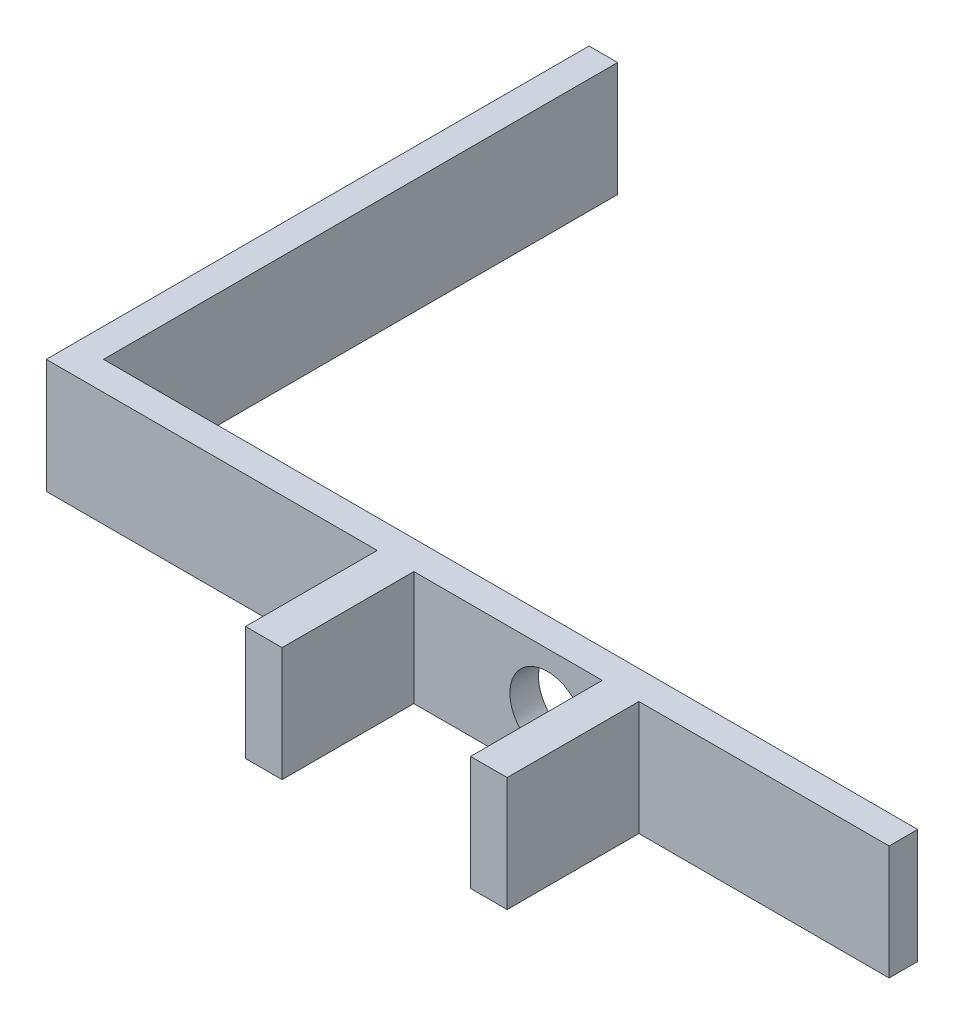
ISO-10303-21;
HEADER;
FILE_DESCRIPTION(('STEP AP214'),'2;1');
FILE_NAME('part.step','',(''),(''),'','','');
FILE_SCHEMA(('AUTOMOTIVE_DESIGN { 1 0 10303 214 1 1 1 1 }'));
ENDSEC;
DATA;
#1=APPLICATION_CONTEXT('core data for automotive mechanical design processes');
#2=APPLICATION_PROTOCOL_DEFINITION('international standard','automotive_design',2000,#1);
#3=PRODUCT_CONTEXT('',#1,'mechanical');
#4=PRODUCT('Part','Part','',(#3));
#5=PRODUCT_RELATED_PRODUCT_CATEGORY('part','',(#4));
#6=PRODUCT_DEFINITION_FORMATION('','',#4);
#7=PRODUCT_DEFINITION_CONTEXT('part definition',#1,'design');
#8=PRODUCT_DEFINITION('design','',#6,#7);
#9=PRODUCT_DEFINITION_SHAPE('','',#8);
#10=(LENGTH_UNIT() NAMED_UNIT(*) SI_UNIT(.MILLI.,.METRE.));
#11=(NAMED_UNIT(*) PLANE_ANGLE_UNIT() SI_UNIT($,.RADIAN.));
#12=(NAMED_UNIT(*) SI_UNIT($,.STERADIAN.) SOLID_ANGLE_UNIT());
#13=UNCERTAINTY_MEASURE_WITH_UNIT(LENGTH_MEASURE(1.E-05),#10,'distance_accuracy_value','');
#14=(GEOMETRIC_REPRESENTATION_CONTEXT(3) GLOBAL_UNCERTAINTY_ASSIGNED_CONTEXT((#13)) GLOBAL_UNIT_ASSIGNED_CONTEXT((#10,
#11,#12)) REPRESENTATION_CONTEXT('',''));
#15=CARTESIAN_POINT('',(0.,0.,0.));
#16=DIRECTION('',(0.,0.,1.));
#17=DIRECTION('',(1.,0.,0.));
#18=AXIS2_PLACEMENT_3D('',#15,#16,#17);
#19=CARTESIAN_POINT('',(3.96875,7.9375,0.));
#20=DIRECTION('',(0.,0.,-1.));
#21=DIRECTION('',(-1.,0.,0.));
#22=AXIS2_PLACEMENT_3D('',#19,#20,#21);
#23=PLANE('',#22);
#24=CARTESIAN_POINT('',(69.56425,0.,0.));
#25=DIRECTION('',(0.,0.,1.));
#26=DIRECTION('',(1.,0.,0.));
#27=AXIS2_PLACEMENT_3D('',#24,#25,#26);
#28=CIRCLE('',#27,5.20700000000001);
#29=CARTESIAN_POINT('',(74.77125,0.,0.));
#30=VERTEX_POINT('',#29);
#31=EDGE_CURVE('E196',#30,#30,#28,.T.);
#32=ORIENTED_EDGE('',*,*,#31,.F.);
#33=EDGE_LOOP('',(#32));
#34=FACE_BOUND('',#33,.T.);
#35=DIRECTION('',(0.,-1.,0.));
#36=VECTOR('',#35,1.);
#37=CARTESIAN_POINT('',(77.18425,7.9375,0.));
#38=LINE('',#37,#36);
#39=CARTESIAN_POINT('',(77.18425,7.9375,0.));
#40=VERTEX_POINT('',#39);
#41=CARTESIAN_POINT('',(77.18425,-7.9375,0.));
#42=VERTEX_POINT('',#41);
#43=EDGE_CURVE('E61',#40,#42,#38,.T.);
#44=ORIENTED_EDGE('',*,*,#43,.F.);
#45=DIRECTION('',(1.,0.,0.));
#46=VECTOR('',#45,1.);
#47=CARTESIAN_POINT('',(0.,7.9375,0.));
#48=LINE('',#47,#46);
#49=CARTESIAN_POINT('',(51.02225,7.9375,0.));
#50=VERTEX_POINT('',#49);
#51=EDGE_CURVE('E211',#50,#40,#48,.T.);
#52=ORIENTED_EDGE('',*,*,#51,.F.);
#53=DIRECTION('',(0.,1.,0.));
#54=VECTOR('',#53,1.);
#55=CARTESIAN_POINT('',(51.02225,7.9375,0.));
#56=LINE('',#55,#54);
#57=CARTESIAN_POINT('',(51.02225,-7.9375,0.));
#58=VERTEX_POINT('',#57);
#59=EDGE_CURVE('E167',#58,#50,#56,.T.);
#60=ORIENTED_EDGE('',*,*,#59,.F.);
#61=DIRECTION('',(1.,0.,0.));
#62=VECTOR('',#61,1.);
#63=CARTESIAN_POINT('',(3.96875,-7.9375,0.));
#64=LINE('',#63,#62);
#65=EDGE_CURVE('E226',#58,#42,#64,.T.);
#66=ORIENTED_EDGE('',*,*,#65,.T.);
#67=EDGE_LOOP('',(#44,#52,#60,#66));
#68=FACE_BOUND('',#67,.T.);
#69=ADVANCED_FACE('F38',(#34,#68),#23,.F.);
#70=DIRECTION('',(0.,1.,0.));
#71=VECTOR('',#70,1.);
#72=CARTESIAN_POINT('',(82.26425,7.9375,0.));
#73=LINE('',#72,#71);
#74=CARTESIAN_POINT('',(82.26425,-7.9375,0.));
#75=VERTEX_POINT('',#74);
#76=CARTESIAN_POINT('',(82.26425,7.9375,0.));
#77=VERTEX_POINT('',#76);
#78=EDGE_CURVE('E161',#75,#77,#73,.T.);
#79=ORIENTED_EDGE('',*,*,#78,.F.);
#80=CARTESIAN_POINT('',(116.99875,-7.9375,0.));
#81=VERTEX_POINT('',#80);
#82=EDGE_CURVE('E222',#75,#81,#64,.T.);
#83=ORIENTED_EDGE('',*,*,#82,.T.);
#84=DIRECTION('',(0.,-1.,0.));
#85=VECTOR('',#84,1.);
#86=CARTESIAN_POINT('',(116.99875,7.9375,0.));
#87=LINE('',#86,#85);
#88=CARTESIAN_POINT('',(116.99875,7.9375,0.));
#89=VERTEX_POINT('',#88);
#90=EDGE_CURVE('E46',#89,#81,#87,.T.);
#91=ORIENTED_EDGE('',*,*,#90,.F.);
#92=EDGE_CURVE('E53',#77,#89,#48,.T.);
#93=ORIENTED_EDGE('',*,*,#92,.F.);
#94=EDGE_LOOP('',(#79,#83,#91,#93));
#95=FACE_BOUND('',#94,.T.);
#96=ADVANCED_FACE('F276',(#95),#23,.F.);
#97=DIRECTION('',(0.,-1.,0.));
#98=VECTOR('',#97,1.);
#99=CARTESIAN_POINT('',(45.94225,7.9375,0.));
#100=LINE('',#99,#98);
#101=CARTESIAN_POINT('',(45.94225,7.9375,0.));
#102=VERTEX_POINT('',#101);
#103=CARTESIAN_POINT('',(45.94225,-7.9375,0.));
#104=VERTEX_POINT('',#103);
#105=EDGE_CURVE('E164',#102,#104,#100,.T.);
#106=ORIENTED_EDGE('',*,*,#105,.F.);
#107=CARTESIAN_POINT('',(0.,7.9375,0.));
#108=VERTEX_POINT('',#107);
#109=EDGE_CURVE('E207',#108,#102,#48,.T.);
#110=ORIENTED_EDGE('',*,*,#109,.F.);
#111=DIRECTION('',(0.,-1.,0.));
#112=VECTOR('',#111,1.);
#113=CARTESIAN_POINT('',(0.,7.9375,0.));
#114=LINE('',#113,#112);
#115=CARTESIAN_POINT('',(0.,-7.9375,0.));
#116=VERTEX_POINT('',#115);
#117=EDGE_CURVE('E11',#108,#116,#114,.T.);
#118=ORIENTED_EDGE('',*,*,#117,.T.);
#119=EDGE_CURVE('E223',#116,#104,#64,.T.);
#120=ORIENTED_EDGE('',*,*,#119,.T.);
#121=EDGE_LOOP('',(#106,#110,#118,#120));
#122=FACE_BOUND('',#121,.T.);
#123=ADVANCED_FACE('F289',(#122),#23,.F.);
#124=CARTESIAN_POINT('',(0.,7.9375,0.));
#125=DIRECTION('',(1.,0.,0.));
#126=DIRECTION('',(0.,0.,-1.));
#127=AXIS2_PLACEMENT_3D('',#124,#125,#126);
#128=PLANE('',#127);
#129=DIRECTION('',(0.,0.,1.));
#130=VECTOR('',#129,1.);
#131=CARTESIAN_POINT('',(0.,-7.9375,0.));
#132=LINE('',#131,#130);
#133=CARTESIAN_POINT('',(0.,-7.9375,-75.34275));
#134=VERTEX_POINT('',#133);
#135=EDGE_CURVE('E202',#134,#116,#132,.T.);
#136=ORIENTED_EDGE('',*,*,#135,.T.);
#137=ORIENTED_EDGE('',*,*,#117,.F.);
#138=DIRECTION('',(0.,0.,1.));
#139=VECTOR('',#138,1.);
#140=CARTESIAN_POINT('',(0.,7.9375,0.));
#141=LINE('',#140,#139);
#142=CARTESIAN_POINT('',(0.,7.9375,-75.34275));
#143=VERTEX_POINT('',#142);
#144=EDGE_CURVE('E203',#143,#108,#141,.T.);
#145=ORIENTED_EDGE('',*,*,#144,.F.);
#146=DIRECTION('',(0.,-1.,0.));
#147=VECTOR('',#146,1.);
#148=CARTESIAN_POINT('',(0.,7.9375,-75.34275));
#149=LINE('',#148,#147);
#150=EDGE_CURVE('E219',#143,#134,#149,.T.);
#151=ORIENTED_EDGE('',*,*,#150,.T.);
#152=EDGE_LOOP('',(#136,#137,#145,#151));
#153=FACE_BOUND('',#152,.T.);
#154=ADVANCED_FACE('F40',(#153),#128,.F.);
#155=CARTESIAN_POINT('',(116.99875,7.9375,0.));
#156=DIRECTION('',(-1.,0.,0.));
#157=DIRECTION('',(0.,0.,1.));
#158=AXIS2_PLACEMENT_3D('',#155,#156,#157);
#159=PLANE('',#158);
#160=DIRECTION('',(0.,0.,-1.));
#161=VECTOR('',#160,1.);
#162=CARTESIAN_POINT('',(116.99875,-7.9375,0.));
#163=LINE('',#162,#161);
#164=CARTESIAN_POINT('',(116.99875,-7.9375,-3.96875000000001));
#165=VERTEX_POINT('',#164);
#166=EDGE_CURVE('E225',#81,#165,#163,.T.);
#167=ORIENTED_EDGE('',*,*,#166,.T.);
#168=DIRECTION('',(0.,-1.,0.));
#169=VECTOR('',#168,1.);
#170=CARTESIAN_POINT('',(116.99875,7.9375,-3.96875000000001));
#171=LINE('',#170,#169);
#172=CARTESIAN_POINT('',(116.99875,7.9375,-3.96875000000001));
#173=VERTEX_POINT('',#172);
#174=EDGE_CURVE('E241',#173,#165,#171,.T.);
#175=ORIENTED_EDGE('',*,*,#174,.F.);
#176=DIRECTION('',(0.,0.,-1.));
#177=VECTOR('',#176,1.);
#178=CARTESIAN_POINT('',(116.99875,7.9375,0.));
#179=LINE('',#178,#177);
#180=EDGE_CURVE('E210',#89,#173,#179,.T.);
#181=ORIENTED_EDGE('',*,*,#180,.F.);
#182=ORIENTED_EDGE('',*,*,#90,.T.);
#183=EDGE_LOOP('',(#167,#175,#181,#182));
#184=FACE_BOUND('',#183,.T.);
#185=ADVANCED_FACE('F247',(#184),#159,.F.);
#186=CARTESIAN_POINT('',(3.96875,7.9375,-3.96875));
#187=DIRECTION('',(0.,0.,1.));
#188=DIRECTION('',(1.,0.,0.));
#189=AXIS2_PLACEMENT_3D('',#186,#187,#188);
#190=PLANE('',#189);
#191=CARTESIAN_POINT('',(69.56425,0.,-3.96875));
#192=DIRECTION('',(0.,0.,1.));
#193=DIRECTION('',(1.,0.,0.));
#194=AXIS2_PLACEMENT_3D('',#191,#192,#193);
#195=CIRCLE('',#194,5.20700000000001);
#196=CARTESIAN_POINT('',(74.77125,0.,-3.96875));
#197=VERTEX_POINT('',#196);
#198=EDGE_CURVE('E199',#197,#197,#195,.F.);
#199=ORIENTED_EDGE('',*,*,#198,.F.);
#200=EDGE_LOOP('',(#199));
#201=FACE_BOUND('',#200,.T.);
#202=DIRECTION('',(-1.,0.,0.));
#203=VECTOR('',#202,1.);
#204=CARTESIAN_POINT('',(3.96875,-7.9375,-3.96875));
#205=LINE('',#204,#203);
#206=CARTESIAN_POINT('',(3.96875,-7.9375,-3.96875));
#207=VERTEX_POINT('',#206);
#208=EDGE_CURVE('E228',#165,#207,#205,.T.);
#209=ORIENTED_EDGE('',*,*,#208,.T.);
#210=DIRECTION('',(0.,-1.,0.));
#211=VECTOR('',#210,1.);
#212=CARTESIAN_POINT('',(3.96875,7.9375,-3.96875));
#213=LINE('',#212,#211);
#214=CARTESIAN_POINT('',(3.96875,7.9375,-3.96875));
#215=VERTEX_POINT('',#214);
#216=EDGE_CURVE('E238',#215,#207,#213,.T.);
#217=ORIENTED_EDGE('',*,*,#216,.F.);
#218=DIRECTION('',(-1.,0.,0.));
#219=VECTOR('',#218,1.);
#220=CARTESIAN_POINT('',(3.96875,7.9375,-3.96875));
#221=LINE('',#220,#219);
#222=EDGE_CURVE('E213',#173,#215,#221,.T.);
#223=ORIENTED_EDGE('',*,*,#222,.F.);
#224=ORIENTED_EDGE('',*,*,#174,.T.);
#225=EDGE_LOOP('',(#209,#217,#223,#224));
#226=FACE_BOUND('',#225,.T.);
#227=ADVANCED_FACE('F254',(#201,#226),#190,.F.);
#228=CARTESIAN_POINT('',(3.96875,7.9375,-3.96875));
#229=DIRECTION('',(-1.,0.,0.));
#230=DIRECTION('',(0.,0.,1.));
#231=AXIS2_PLACEMENT_3D('',#228,#229,#230);
#232=PLANE('',#231);
#233=DIRECTION('',(0.,0.,-1.));
#234=VECTOR('',#233,1.);
#235=CARTESIAN_POINT('',(3.96875,-7.9375,-3.96875));
#236=LINE('',#235,#234);
#237=CARTESIAN_POINT('',(3.96875,-7.9375,-75.34275));
#238=VERTEX_POINT('',#237);
#239=EDGE_CURVE('E230',#207,#238,#236,.T.);
#240=ORIENTED_EDGE('',*,*,#239,.T.);
#241=DIRECTION('',(0.,-1.,0.));
#242=VECTOR('',#241,1.);
#243=CARTESIAN_POINT('',(3.96875,7.9375,-75.34275));
#244=LINE('',#243,#242);
#245=CARTESIAN_POINT('',(3.96875,7.9375,-75.34275));
#246=VERTEX_POINT('',#245);
#247=EDGE_CURVE('E235',#246,#238,#244,.T.);
#248=ORIENTED_EDGE('',*,*,#247,.F.);
#249=DIRECTION('',(0.,0.,-1.));
#250=VECTOR('',#249,1.);
#251=CARTESIAN_POINT('',(3.96875,7.9375,-3.96875));
#252=LINE('',#251,#250);
#253=EDGE_CURVE('E215',#215,#246,#252,.T.);
#254=ORIENTED_EDGE('',*,*,#253,.F.);
#255=ORIENTED_EDGE('',*,*,#216,.T.);
#256=EDGE_LOOP('',(#240,#248,#254,#255));
#257=FACE_BOUND('',#256,.T.);
#258=ADVANCED_FACE('F258',(#257),#232,.F.);
#259=CARTESIAN_POINT('',(0.,7.9375,-75.34275));
#260=DIRECTION('',(0.,0.,1.));
#261=DIRECTION('',(1.,0.,0.));
#262=AXIS2_PLACEMENT_3D('',#259,#260,#261);
#263=PLANE('',#262);
#264=DIRECTION('',(-1.,0.,0.));
#265=VECTOR('',#264,1.);
#266=CARTESIAN_POINT('',(0.,-7.9375,-75.34275));
#267=LINE('',#266,#265);
#268=EDGE_CURVE('E206',#238,#134,#267,.T.);
#269=ORIENTED_EDGE('',*,*,#268,.T.);
#270=ORIENTED_EDGE('',*,*,#150,.F.);
#271=DIRECTION('',(-1.,0.,0.));
#272=VECTOR('',#271,1.);
#273=CARTESIAN_POINT('',(0.,7.9375,-75.34275));
#274=LINE('',#273,#272);
#275=EDGE_CURVE('E217',#246,#143,#274,.T.);
#276=ORIENTED_EDGE('',*,*,#275,.F.);
#277=ORIENTED_EDGE('',*,*,#247,.T.);
#278=EDGE_LOOP('',(#269,#270,#276,#277));
#279=FACE_BOUND('',#278,.T.);
#280=ADVANCED_FACE('F294',(#279),#263,.F.);
#281=CARTESIAN_POINT('',(0.,7.9375,0.));
#282=DIRECTION('',(0.,-1.,0.));
#283=DIRECTION('',(0.,0.,-1.));
#284=AXIS2_PLACEMENT_3D('',#281,#282,#283);
#285=PLANE('',#284);
#286=ORIENTED_EDGE('',*,*,#144,.T.);
#287=ORIENTED_EDGE('',*,*,#109,.T.);
#288=DIRECTION('',(0.,0.,-1.));
#289=VECTOR('',#288,1.);
#290=CARTESIAN_POINT('',(45.94225,7.9375,18.288));
#291=LINE('',#290,#289);
#292=CARTESIAN_POINT('',(45.94225,7.9375,18.288));
#293=VERTEX_POINT('',#292);
#294=EDGE_CURVE('E181',#293,#102,#291,.T.);
#295=ORIENTED_EDGE('',*,*,#294,.F.);
#296=DIRECTION('',(-1.,0.,0.));
#297=VECTOR('',#296,1.);
#298=CARTESIAN_POINT('',(45.94225,7.9375,18.288));
#299=LINE('',#298,#297);
#300=CARTESIAN_POINT('',(51.02225,7.9375,18.288));
#301=VERTEX_POINT('',#300);
#302=EDGE_CURVE('E180',#301,#293,#299,.T.);
#303=ORIENTED_EDGE('',*,*,#302,.F.);
#304=DIRECTION('',(0.,0.,-1.));
#305=VECTOR('',#304,1.);
#306=CARTESIAN_POINT('',(51.02225,7.9375,18.288));
#307=LINE('',#306,#305);
#308=EDGE_CURVE('E187',#301,#50,#307,.T.);
#309=ORIENTED_EDGE('',*,*,#308,.T.);
#310=ORIENTED_EDGE('',*,*,#51,.T.);
#311=DIRECTION('',(0.,0.,-1.));
#312=VECTOR('',#311,1.);
#313=CARTESIAN_POINT('',(77.18425,7.9375,18.288));
#314=LINE('',#313,#312);
#315=CARTESIAN_POINT('',(77.18425,7.9375,18.288));
#316=VERTEX_POINT('',#315);
#317=EDGE_CURVE('E266',#316,#40,#314,.T.);
#318=ORIENTED_EDGE('',*,*,#317,.F.);
#319=DIRECTION('',(-1.,0.,0.));
#320=VECTOR('',#319,1.);
#321=CARTESIAN_POINT('',(77.18425,7.9375,18.288));
#322=LINE('',#321,#320);
#323=CARTESIAN_POINT('',(82.26425,7.9375,18.288));
#324=VERTEX_POINT('',#323);
#325=EDGE_CURVE('E157',#324,#316,#322,.T.);
#326=ORIENTED_EDGE('',*,*,#325,.F.);
#327=DIRECTION('',(0.,0.,-1.));
#328=VECTOR('',#327,1.);
#329=CARTESIAN_POINT('',(82.26425,7.9375,18.288));
#330=LINE('',#329,#328);
#331=EDGE_CURVE('E169',#324,#77,#330,.T.);
#332=ORIENTED_EDGE('',*,*,#331,.T.);
#333=ORIENTED_EDGE('',*,*,#92,.T.);
#334=ORIENTED_EDGE('',*,*,#180,.T.);
#335=ORIENTED_EDGE('',*,*,#222,.T.);
#336=ORIENTED_EDGE('',*,*,#253,.T.);
#337=ORIENTED_EDGE('',*,*,#275,.T.);
#338=EDGE_LOOP('',(#286,#287,#295,#303,#309,#310,#318,#326,#332,#333,#334,#335,#336,#337));
#339=FACE_BOUND('',#338,.T.);
#340=ADVANCED_FACE('F262',(#339),#285,.F.);
#341=CARTESIAN_POINT('',(0.,-7.9375,0.));
#342=DIRECTION('',(0.,-1.,0.));
#343=DIRECTION('',(0.,0.,-1.));
#344=AXIS2_PLACEMENT_3D('',#341,#342,#343);
#345=PLANE('',#344);
#346=ORIENTED_EDGE('',*,*,#135,.F.);
#347=ORIENTED_EDGE('',*,*,#268,.F.);
#348=ORIENTED_EDGE('',*,*,#239,.F.);
#349=ORIENTED_EDGE('',*,*,#208,.F.);
#350=ORIENTED_EDGE('',*,*,#166,.F.);
#351=ORIENTED_EDGE('',*,*,#82,.F.);
#352=DIRECTION('',(0.,0.,-1.));
#353=VECTOR('',#352,1.);
#354=CARTESIAN_POINT('',(82.26425,-7.9375,18.288));
#355=LINE('',#354,#353);
#356=CARTESIAN_POINT('',(82.26425,-7.9375,18.288));
#357=VERTEX_POINT('',#356);
#358=EDGE_CURVE('E148',#357,#75,#355,.T.);
#359=ORIENTED_EDGE('',*,*,#358,.F.);
#360=DIRECTION('',(1.,0.,0.));
#361=VECTOR('',#360,1.);
#362=CARTESIAN_POINT('',(77.18425,-7.9375,18.288));
#363=LINE('',#362,#361);
#364=CARTESIAN_POINT('',(77.18425,-7.9375,18.288));
#365=VERTEX_POINT('',#364);
#366=EDGE_CURVE('E140',#365,#357,#363,.T.);
#367=ORIENTED_EDGE('',*,*,#366,.F.);
#368=DIRECTION('',(0.,0.,-1.));
#369=VECTOR('',#368,1.);
#370=CARTESIAN_POINT('',(77.18425,-7.9375,18.288));
#371=LINE('',#370,#369);
#372=EDGE_CURVE('E146',#365,#42,#371,.T.);
#373=ORIENTED_EDGE('',*,*,#372,.T.);
#374=ORIENTED_EDGE('',*,*,#65,.F.);
#375=DIRECTION('',(0.,0.,-1.));
#376=VECTOR('',#375,1.);
#377=CARTESIAN_POINT('',(51.02225,-7.9375,18.288));
#378=LINE('',#377,#376);
#379=CARTESIAN_POINT('',(51.02225,-7.9375,18.288));
#380=VERTEX_POINT('',#379);
#381=EDGE_CURVE('E190',#380,#58,#378,.T.);
#382=ORIENTED_EDGE('',*,*,#381,.F.);
#383=DIRECTION('',(1.,0.,0.));
#384=VECTOR('',#383,1.);
#385=CARTESIAN_POINT('',(45.94225,-7.9375,18.288));
#386=LINE('',#385,#384);
#387=CARTESIAN_POINT('',(45.94225,-7.9375,18.288));
#388=VERTEX_POINT('',#387);
#389=EDGE_CURVE('E176',#388,#380,#386,.T.);
#390=ORIENTED_EDGE('',*,*,#389,.F.);
#391=DIRECTION('',(0.,0.,-1.));
#392=VECTOR('',#391,1.);
#393=CARTESIAN_POINT('',(45.94225,-7.9375,18.288));
#394=LINE('',#393,#392);
#395=EDGE_CURVE('E193',#388,#104,#394,.T.);
#396=ORIENTED_EDGE('',*,*,#395,.T.);
#397=ORIENTED_EDGE('',*,*,#119,.F.);
#398=EDGE_LOOP('',(#346,#347,#348,#349,#350,#351,#359,#367,#373,#374,#382,#390,#396,#397));
#399=FACE_BOUND('',#398,.T.);
#400=ADVANCED_FACE('F143',(#399),#345,.T.);
#401=CARTESIAN_POINT('',(69.56425,0.,-18.6963700385534));
#402=DIRECTION('',(0.,0.,1.));
#403=DIRECTION('',(1.,0.,0.));
#404=AXIS2_PLACEMENT_3D('',#401,#402,#403);
#405=CYLINDRICAL_SURFACE('',#404,5.20700000000001);
#406=ORIENTED_EDGE('',*,*,#198,.T.);
#407=EDGE_LOOP('',(#406));
#408=FACE_BOUND('',#407,.T.);
#409=ORIENTED_EDGE('',*,*,#31,.T.);
#410=EDGE_LOOP('',(#409));
#411=FACE_BOUND('',#410,.T.);
#412=ADVANCED_FACE('F330',(#408,#411),#405,.F.);
#413=CARTESIAN_POINT('',(45.94225,7.9375,18.288));
#414=DIRECTION('',(1.,0.,0.));
#415=DIRECTION('',(0.,0.,-1.));
#416=AXIS2_PLACEMENT_3D('',#413,#414,#415);
#417=PLANE('',#416);
#418=ORIENTED_EDGE('',*,*,#105,.T.);
#419=ORIENTED_EDGE('',*,*,#395,.F.);
#420=DIRECTION('',(0.,-1.,0.));
#421=VECTOR('',#420,1.);
#422=CARTESIAN_POINT('',(45.94225,7.9375,18.288));
#423=LINE('',#422,#421);
#424=EDGE_CURVE('E173',#293,#388,#423,.T.);
#425=ORIENTED_EDGE('',*,*,#424,.F.);
#426=ORIENTED_EDGE('',*,*,#294,.T.);
#427=EDGE_LOOP('',(#418,#419,#425,#426));
#428=FACE_BOUND('',#427,.T.);
#429=ADVANCED_FACE('F287',(#428),#417,.F.);
#430=CARTESIAN_POINT('',(51.02225,7.9375,18.288));
#431=DIRECTION('',(-1.,0.,0.));
#432=DIRECTION('',(0.,0.,1.));
#433=AXIS2_PLACEMENT_3D('',#430,#431,#432);
#434=PLANE('',#433);
#435=ORIENTED_EDGE('',*,*,#59,.T.);
#436=ORIENTED_EDGE('',*,*,#308,.F.);
#437=DIRECTION('',(0.,1.,0.));
#438=VECTOR('',#437,1.);
#439=CARTESIAN_POINT('',(51.02225,7.9375,18.288));
#440=LINE('',#439,#438);
#441=EDGE_CURVE('E178',#380,#301,#440,.T.);
#442=ORIENTED_EDGE('',*,*,#441,.F.);
#443=ORIENTED_EDGE('',*,*,#381,.T.);
#444=EDGE_LOOP('',(#435,#436,#442,#443));
#445=FACE_BOUND('',#444,.T.);
#446=ADVANCED_FACE('F280',(#445),#434,.F.);
#447=CARTESIAN_POINT('',(0.,0.,18.288));
#448=DIRECTION('',(0.,0.,1.));
#449=DIRECTION('',(1.,0.,0.));
#450=AXIS2_PLACEMENT_3D('',#447,#448,#449);
#451=PLANE('',#450);
#452=ORIENTED_EDGE('',*,*,#424,.T.);
#453=ORIENTED_EDGE('',*,*,#389,.T.);
#454=ORIENTED_EDGE('',*,*,#441,.T.);
#455=ORIENTED_EDGE('',*,*,#302,.T.);
#456=EDGE_LOOP('',(#452,#453,#454,#455));
#457=FACE_BOUND('',#456,.T.);
#458=ADVANCED_FACE('F282',(#457),#451,.T.);
#459=CARTESIAN_POINT('',(77.18425,7.9375,18.288));
#460=DIRECTION('',(1.,0.,0.));
#461=DIRECTION('',(0.,0.,-1.));
#462=AXIS2_PLACEMENT_3D('',#459,#460,#461);
#463=PLANE('',#462);
#464=ORIENTED_EDGE('',*,*,#43,.T.);
#465=ORIENTED_EDGE('',*,*,#372,.F.);
#466=DIRECTION('',(0.,-1.,0.));
#467=VECTOR('',#466,1.);
#468=CARTESIAN_POINT('',(77.18425,7.9375,18.288));
#469=LINE('',#468,#467);
#470=EDGE_CURVE('E152',#316,#365,#469,.T.);
#471=ORIENTED_EDGE('',*,*,#470,.F.);
#472=ORIENTED_EDGE('',*,*,#317,.T.);
#473=EDGE_LOOP('',(#464,#465,#471,#472));
#474=FACE_BOUND('',#473,.T.);
#475=ADVANCED_FACE('F163',(#474),#463,.F.);
#476=CARTESIAN_POINT('',(82.26425,7.9375,18.288));
#477=DIRECTION('',(-1.,0.,0.));
#478=DIRECTION('',(0.,0.,1.));
#479=AXIS2_PLACEMENT_3D('',#476,#477,#478);
#480=PLANE('',#479);
#481=ORIENTED_EDGE('',*,*,#78,.T.);
#482=ORIENTED_EDGE('',*,*,#331,.F.);
#483=DIRECTION('',(0.,1.,0.));
#484=VECTOR('',#483,1.);
#485=CARTESIAN_POINT('',(82.26425,7.9375,18.288));
#486=LINE('',#485,#484);
#487=EDGE_CURVE('E151',#357,#324,#486,.T.);
#488=ORIENTED_EDGE('',*,*,#487,.F.);
#489=ORIENTED_EDGE('',*,*,#358,.T.);
#490=EDGE_LOOP('',(#481,#482,#488,#489));
#491=FACE_BOUND('',#490,.T.);
#492=ADVANCED_FACE('F275',(#491),#480,.F.);
#493=CARTESIAN_POINT('',(0.,0.,18.288));
#494=DIRECTION('',(0.,0.,1.));
#495=DIRECTION('',(1.,0.,0.));
#496=AXIS2_PLACEMENT_3D('',#493,#494,#495);
#497=PLANE('',#496);
#498=ORIENTED_EDGE('',*,*,#470,.T.);
#499=ORIENTED_EDGE('',*,*,#366,.T.);
#500=ORIENTED_EDGE('',*,*,#487,.T.);
#501=ORIENTED_EDGE('',*,*,#325,.T.);
#502=EDGE_LOOP('',(#498,#499,#500,#501));
#503=FACE_BOUND('',#502,.T.);
#504=ADVANCED_FACE('F155',(#503),#497,.T.);
#505=CLOSED_SHELL('',(#69,#96,#123,#154,#185,#227,#258,#280,#340,#400,#412,#429,#446,#458,#475,
#492,#504));
#506=MANIFOLD_SOLID_BREP('B2',#505);
#507=ADVANCED_BREP_SHAPE_REPRESENTATION('',(#18,#506),#14);
#508=SHAPE_DEFINITION_REPRESENTATION(#9,#507);
ENDSEC;
END-ISO-10303-21;
